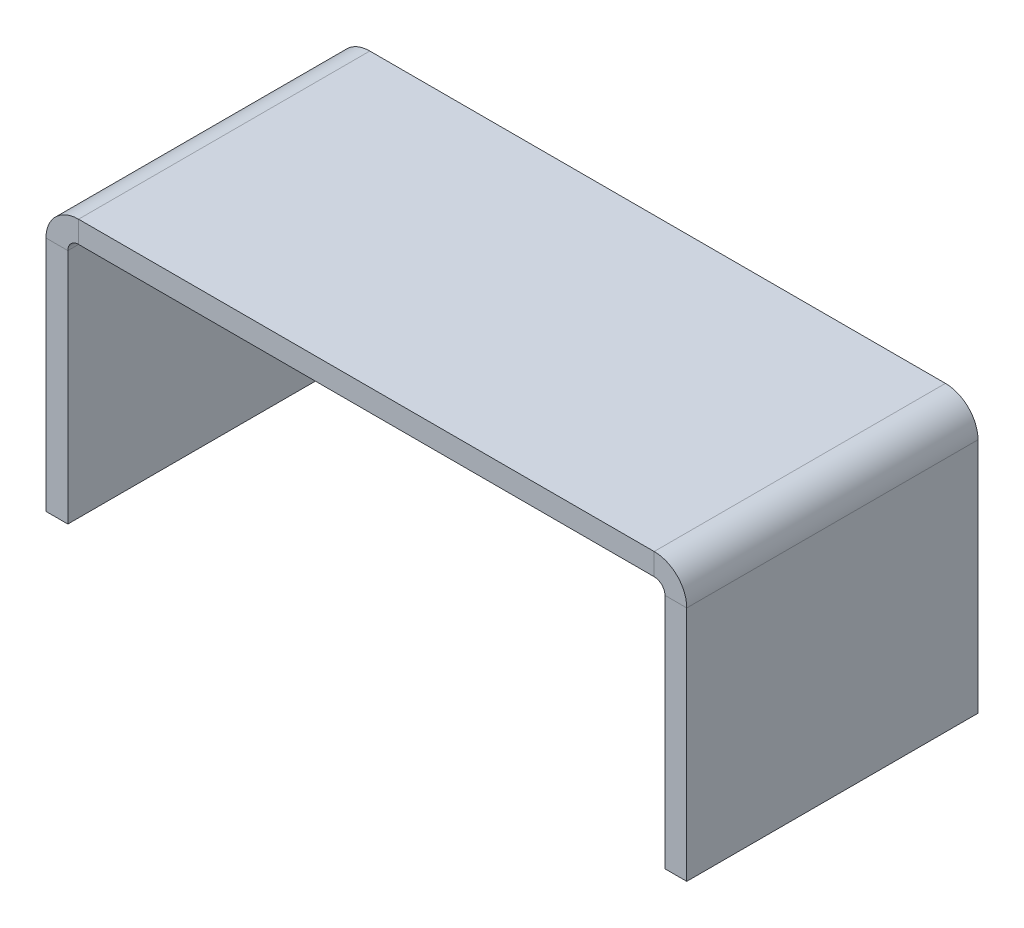
ISO-10303-21;
HEADER;
FILE_DESCRIPTION(('STEP AP214'),'2;1');
FILE_NAME('part.step','',(''),(''),'','','');
FILE_SCHEMA(('AUTOMOTIVE_DESIGN { 1 0 10303 214 1 1 1 1 }'));
ENDSEC;
DATA;
#1=APPLICATION_CONTEXT('core data for automotive mechanical design processes');
#2=APPLICATION_PROTOCOL_DEFINITION('international standard','automotive_design',2000,#1);
#3=PRODUCT_CONTEXT('',#1,'mechanical');
#4=PRODUCT('Part','Part','',(#3));
#5=PRODUCT_RELATED_PRODUCT_CATEGORY('part','',(#4));
#6=PRODUCT_DEFINITION_FORMATION('','',#4);
#7=PRODUCT_DEFINITION_CONTEXT('part definition',#1,'design');
#8=PRODUCT_DEFINITION('design','',#6,#7);
#9=PRODUCT_DEFINITION_SHAPE('','',#8);
#10=(LENGTH_UNIT() NAMED_UNIT(*) SI_UNIT(.MILLI.,.METRE.));
#11=(NAMED_UNIT(*) PLANE_ANGLE_UNIT() SI_UNIT($,.RADIAN.));
#12=(NAMED_UNIT(*) SI_UNIT($,.STERADIAN.) SOLID_ANGLE_UNIT());
#13=UNCERTAINTY_MEASURE_WITH_UNIT(LENGTH_MEASURE(1.E-05),#10,'distance_accuracy_value','');
#14=(GEOMETRIC_REPRESENTATION_CONTEXT(3) GLOBAL_UNCERTAINTY_ASSIGNED_CONTEXT((#13)) GLOBAL_UNIT_ASSIGNED_CONTEXT((#10,
#11,#12)) REPRESENTATION_CONTEXT('',''));
#15=CARTESIAN_POINT('',(0.,0.,0.));
#16=DIRECTION('',(0.,0.,1.));
#17=DIRECTION('',(1.,0.,0.));
#18=AXIS2_PLACEMENT_3D('',#15,#16,#17);
#19=CARTESIAN_POINT('',(0.,-1.5,0.));
#20=DIRECTION('',(0.,-1.,0.));
#21=DIRECTION('',(0.,0.,-1.));
#22=AXIS2_PLACEMENT_3D('',#19,#20,#21);
#23=PLANE('',#22);
#24=DIRECTION('',(-1.,0.,0.));
#25=VECTOR('',#24,1.);
#26=CARTESIAN_POINT('',(-22.,-1.5,-10.));
#27=LINE('',#26,#25);
#28=CARTESIAN_POINT('',(19.7634,-1.5,-10.));
#29=VERTEX_POINT('',#28);
#30=CARTESIAN_POINT('',(-19.7634,-1.5,-10.));
#31=VERTEX_POINT('',#30);
#32=EDGE_CURVE('E90',#29,#31,#27,.T.);
#33=ORIENTED_EDGE('',*,*,#32,.F.);
#34=DIRECTION('',(0.,0.,1.));
#35=VECTOR('',#34,1.);
#36=CARTESIAN_POINT('',(19.7634,-1.5,10.));
#37=LINE('',#36,#35);
#38=CARTESIAN_POINT('',(19.7634,-1.5,10.));
#39=VERTEX_POINT('',#38);
#40=EDGE_CURVE('E226',#39,#29,#37,.F.);
#41=ORIENTED_EDGE('',*,*,#40,.F.);
#42=DIRECTION('',(1.,0.,0.));
#43=VECTOR('',#42,1.);
#44=CARTESIAN_POINT('',(-22.,-1.5,10.));
#45=LINE('',#44,#43);
#46=CARTESIAN_POINT('',(-19.7634,-1.5,10.));
#47=VERTEX_POINT('',#46);
#48=EDGE_CURVE('E13',#47,#39,#45,.T.);
#49=ORIENTED_EDGE('',*,*,#48,.F.);
#50=DIRECTION('',(0.,0.,-1.));
#51=VECTOR('',#50,1.);
#52=CARTESIAN_POINT('',(-19.7634,-1.5,-10.));
#53=LINE('',#52,#51);
#54=EDGE_CURVE('E280',#31,#47,#53,.F.);
#55=ORIENTED_EDGE('',*,*,#54,.F.);
#56=EDGE_LOOP('',(#33,#41,#49,#55));
#57=FACE_BOUND('',#56,.T.);
#58=ADVANCED_FACE('F81',(#57),#23,.T.);
#59=CARTESIAN_POINT('',(0.,0.,0.));
#60=DIRECTION('',(0.,-1.,0.));
#61=DIRECTION('',(0.,0.,-1.));
#62=AXIS2_PLACEMENT_3D('',#59,#60,#61);
#63=PLANE('',#62);
#64=DIRECTION('',(0.,0.,1.));
#65=VECTOR('',#64,1.);
#66=CARTESIAN_POINT('',(19.7634,0.,10.));
#67=LINE('',#66,#65);
#68=CARTESIAN_POINT('',(19.7634,0.,10.));
#69=VERTEX_POINT('',#68);
#70=CARTESIAN_POINT('',(19.7634,0.,-10.));
#71=VERTEX_POINT('',#70);
#72=EDGE_CURVE('E214',#69,#71,#67,.F.);
#73=ORIENTED_EDGE('',*,*,#72,.T.);
#74=DIRECTION('',(-1.,0.,0.));
#75=VECTOR('',#74,1.);
#76=CARTESIAN_POINT('',(-22.,0.,-10.));
#77=LINE('',#76,#75);
#78=CARTESIAN_POINT('',(-19.7634,0.,-10.));
#79=VERTEX_POINT('',#78);
#80=EDGE_CURVE('E286',#71,#79,#77,.T.);
#81=ORIENTED_EDGE('',*,*,#80,.T.);
#82=DIRECTION('',(0.,0.,-1.));
#83=VECTOR('',#82,1.);
#84=CARTESIAN_POINT('',(-19.7634,0.,-10.));
#85=LINE('',#84,#83);
#86=CARTESIAN_POINT('',(-19.7634,0.,10.));
#87=VERTEX_POINT('',#86);
#88=EDGE_CURVE('E268',#79,#87,#85,.F.);
#89=ORIENTED_EDGE('',*,*,#88,.T.);
#90=DIRECTION('',(1.,0.,0.));
#91=VECTOR('',#90,1.);
#92=CARTESIAN_POINT('',(-22.,0.,10.));
#93=LINE('',#92,#91);
#94=EDGE_CURVE('E85',#87,#69,#93,.T.);
#95=ORIENTED_EDGE('',*,*,#94,.T.);
#96=EDGE_LOOP('',(#73,#81,#89,#95));
#97=FACE_BOUND('',#96,.T.);
#98=ADVANCED_FACE('F292',(#97),#63,.F.);
#99=CARTESIAN_POINT('',(-22.,-1.5,10.));
#100=DIRECTION('',(0.,0.,1.));
#101=DIRECTION('',(1.,0.,0.));
#102=AXIS2_PLACEMENT_3D('',#99,#100,#101);
#103=PLANE('',#102);
#104=ORIENTED_EDGE('',*,*,#48,.T.);
#105=DIRECTION('',(0.,1.,0.));
#106=VECTOR('',#105,1.);
#107=CARTESIAN_POINT('',(19.7634,-1.5,10.));
#108=LINE('',#107,#106);
#109=EDGE_CURVE('E220',#39,#69,#108,.T.);
#110=ORIENTED_EDGE('',*,*,#109,.T.);
#111=ORIENTED_EDGE('',*,*,#94,.F.);
#112=DIRECTION('',(0.,1.,0.));
#113=VECTOR('',#112,1.);
#114=CARTESIAN_POINT('',(-19.7634,-1.5,10.));
#115=LINE('',#114,#113);
#116=EDGE_CURVE('E104',#47,#87,#115,.T.);
#117=ORIENTED_EDGE('',*,*,#116,.F.);
#118=EDGE_LOOP('',(#104,#110,#111,#117));
#119=FACE_BOUND('',#118,.T.);
#120=ADVANCED_FACE('F295',(#119),#103,.T.);
#121=CARTESIAN_POINT('',(-22.,-1.5,-10.));
#122=DIRECTION('',(0.,0.,-1.));
#123=DIRECTION('',(-1.,0.,0.));
#124=AXIS2_PLACEMENT_3D('',#121,#122,#123);
#125=PLANE('',#124);
#126=DIRECTION('',(0.,1.,0.));
#127=VECTOR('',#126,1.);
#128=CARTESIAN_POINT('',(19.7634,-1.5,-10.));
#129=LINE('',#128,#127);
#130=EDGE_CURVE('E232',#29,#71,#129,.T.);
#131=ORIENTED_EDGE('',*,*,#130,.F.);
#132=ORIENTED_EDGE('',*,*,#32,.T.);
#133=DIRECTION('',(0.,1.,0.));
#134=VECTOR('',#133,1.);
#135=CARTESIAN_POINT('',(-19.7634,-1.5,-10.));
#136=LINE('',#135,#134);
#137=EDGE_CURVE('E274',#31,#79,#136,.T.);
#138=ORIENTED_EDGE('',*,*,#137,.T.);
#139=ORIENTED_EDGE('',*,*,#80,.F.);
#140=EDGE_LOOP('',(#131,#132,#138,#139));
#141=FACE_BOUND('',#140,.T.);
#142=ADVANCED_FACE('F83',(#141),#125,.T.);
#143=CARTESIAN_POINT('',(-19.7634,-2.2366,10.));
#144=DIRECTION('',(0.,0.,1.));
#145=DIRECTION('',(1.,0.,0.));
#146=AXIS2_PLACEMENT_3D('',#143,#144,#145);
#147=PLANE('',#146);
#148=DIRECTION('',(1.,0.,0.));
#149=VECTOR('',#148,1.);
#150=CARTESIAN_POINT('',(-22.,-2.23659999999999,10.));
#151=LINE('',#150,#149);
#152=CARTESIAN_POINT('',(-20.5,-2.2366,10.));
#153=VERTEX_POINT('',#152);
#154=CARTESIAN_POINT('',(-22.,-2.23659999999999,10.));
#155=VERTEX_POINT('',#154);
#156=EDGE_CURVE('E235',#153,#155,#151,.F.);
#157=ORIENTED_EDGE('',*,*,#156,.F.);
#158=CARTESIAN_POINT('',(-19.7634,-2.2366,10.));
#159=DIRECTION('',(0.,0.,-1.));
#160=DIRECTION('',(-1.,0.,0.));
#161=AXIS2_PLACEMENT_3D('',#158,#159,#160);
#162=CIRCLE('',#161,0.7366);
#163=EDGE_CURVE('E277',#47,#153,#162,.F.);
#164=ORIENTED_EDGE('',*,*,#163,.F.);
#165=ORIENTED_EDGE('',*,*,#116,.T.);
#166=CARTESIAN_POINT('',(-19.7634,-2.2366,10.));
#167=DIRECTION('',(0.,0.,-1.));
#168=DIRECTION('',(-1.,0.,0.));
#169=AXIS2_PLACEMENT_3D('',#166,#167,#168);
#170=CIRCLE('',#169,2.2366);
#171=EDGE_CURVE('E270',#87,#155,#170,.F.);
#172=ORIENTED_EDGE('',*,*,#171,.T.);
#173=EDGE_LOOP('',(#157,#164,#165,#172));
#174=FACE_BOUND('',#173,.T.);
#175=ADVANCED_FACE('F347',(#174),#147,.T.);
#176=CARTESIAN_POINT('',(-19.7634,-2.2366,-10.));
#177=DIRECTION('',(0.,0.,1.));
#178=DIRECTION('',(1.,0.,0.));
#179=AXIS2_PLACEMENT_3D('',#176,#177,#178);
#180=PLANE('',#179);
#181=CARTESIAN_POINT('',(-19.7634,-2.2366,-10.));
#182=DIRECTION('',(0.,0.,-1.));
#183=DIRECTION('',(-1.,0.,0.));
#184=AXIS2_PLACEMENT_3D('',#181,#182,#183);
#185=CIRCLE('',#184,0.7366);
#186=CARTESIAN_POINT('',(-20.5,-2.2366,-10.));
#187=VERTEX_POINT('',#186);
#188=EDGE_CURVE('E241',#187,#31,#185,.T.);
#189=ORIENTED_EDGE('',*,*,#188,.F.);
#190=DIRECTION('',(1.,0.,0.));
#191=VECTOR('',#190,1.);
#192=CARTESIAN_POINT('',(-20.5,-2.2366,-10.));
#193=LINE('',#192,#191);
#194=CARTESIAN_POINT('',(-22.,-2.23659999999999,-10.));
#195=VERTEX_POINT('',#194);
#196=EDGE_CURVE('E261',#187,#195,#193,.F.);
#197=ORIENTED_EDGE('',*,*,#196,.T.);
#198=CARTESIAN_POINT('',(-19.7634,-2.2366,-10.));
#199=DIRECTION('',(0.,0.,-1.));
#200=DIRECTION('',(-1.,0.,0.));
#201=AXIS2_PLACEMENT_3D('',#198,#199,#200);
#202=CIRCLE('',#201,2.2366);
#203=EDGE_CURVE('E271',#195,#79,#202,.T.);
#204=ORIENTED_EDGE('',*,*,#203,.T.);
#205=ORIENTED_EDGE('',*,*,#137,.F.);
#206=EDGE_LOOP('',(#189,#197,#204,#205));
#207=FACE_BOUND('',#206,.T.);
#208=ADVANCED_FACE('F320',(#207),#180,.F.);
#209=CARTESIAN_POINT('',(-19.7634,-2.2366,-10.));
#210=DIRECTION('',(0.,0.,-1.));
#211=DIRECTION('',(-1.,0.,0.));
#212=AXIS2_PLACEMENT_3D('',#209,#210,#211);
#213=CYLINDRICAL_SURFACE('',#212,2.2366);
#214=ORIENTED_EDGE('',*,*,#88,.F.);
#215=ORIENTED_EDGE('',*,*,#203,.F.);
#216=DIRECTION('',(0.,0.,-1.));
#217=VECTOR('',#216,1.);
#218=CARTESIAN_POINT('',(-22.,-2.23659999999999,10.));
#219=LINE('',#218,#217);
#220=EDGE_CURVE('E259',#195,#155,#219,.F.);
#221=ORIENTED_EDGE('',*,*,#220,.T.);
#222=ORIENTED_EDGE('',*,*,#171,.F.);
#223=EDGE_LOOP('',(#214,#215,#221,#222));
#224=FACE_BOUND('',#223,.T.);
#225=ADVANCED_FACE('F345',(#224),#213,.T.);
#226=CARTESIAN_POINT('',(-19.7634,-2.2366,-10.));
#227=DIRECTION('',(0.,0.,-1.));
#228=DIRECTION('',(-1.,0.,0.));
#229=AXIS2_PLACEMENT_3D('',#226,#227,#228);
#230=CYLINDRICAL_SURFACE('',#229,0.7366);
#231=ORIENTED_EDGE('',*,*,#54,.T.);
#232=ORIENTED_EDGE('',*,*,#163,.T.);
#233=DIRECTION('',(0.,0.,-1.));
#234=VECTOR('',#233,1.);
#235=CARTESIAN_POINT('',(-20.5,-2.2366,10.));
#236=LINE('',#235,#234);
#237=EDGE_CURVE('E264',#153,#187,#236,.T.);
#238=ORIENTED_EDGE('',*,*,#237,.T.);
#239=ORIENTED_EDGE('',*,*,#188,.T.);
#240=EDGE_LOOP('',(#231,#232,#238,#239));
#241=FACE_BOUND('',#240,.T.);
#242=ADVANCED_FACE('F322',(#241),#230,.F.);
#243=CARTESIAN_POINT('',(-22.0000000000001,-18.5,-10.));
#244=DIRECTION('',(0.,0.,1.));
#245=DIRECTION('',(1.,0.,0.));
#246=AXIS2_PLACEMENT_3D('',#243,#244,#245);
#247=PLANE('',#246);
#248=ORIENTED_EDGE('',*,*,#196,.F.);
#249=DIRECTION('',(0.,1.,0.));
#250=VECTOR('',#249,1.);
#251=CARTESIAN_POINT('',(-20.5000000000001,-18.5,-10.));
#252=LINE('',#251,#250);
#253=CARTESIAN_POINT('',(-20.5000000000001,-18.5,-10.));
#254=VERTEX_POINT('',#253);
#255=EDGE_CURVE('E257',#187,#254,#252,.F.);
#256=ORIENTED_EDGE('',*,*,#255,.T.);
#257=DIRECTION('',(1.,0.,0.));
#258=VECTOR('',#257,1.);
#259=CARTESIAN_POINT('',(-22.0000000000001,-18.5,-10.));
#260=LINE('',#259,#258);
#261=CARTESIAN_POINT('',(-22.0000000000001,-18.5,-10.));
#262=VERTEX_POINT('',#261);
#263=EDGE_CURVE('E238',#262,#254,#260,.T.);
#264=ORIENTED_EDGE('',*,*,#263,.F.);
#265=DIRECTION('',(0.,-1.,0.));
#266=VECTOR('',#265,1.);
#267=CARTESIAN_POINT('',(-22.,0.,-10.));
#268=LINE('',#267,#266);
#269=EDGE_CURVE('E250',#195,#262,#268,.T.);
#270=ORIENTED_EDGE('',*,*,#269,.F.);
#271=EDGE_LOOP('',(#248,#256,#264,#270));
#272=FACE_BOUND('',#271,.T.);
#273=ADVANCED_FACE('F339',(#272),#247,.F.);
#274=CARTESIAN_POINT('',(-22.,-1.49999999999999,10.));
#275=DIRECTION('',(0.,0.,-1.));
#276=DIRECTION('',(-1.,0.,0.));
#277=AXIS2_PLACEMENT_3D('',#274,#275,#276);
#278=PLANE('',#277);
#279=ORIENTED_EDGE('',*,*,#156,.T.);
#280=DIRECTION('',(0.,1.,0.));
#281=VECTOR('',#280,1.);
#282=CARTESIAN_POINT('',(-22.,0.,10.));
#283=LINE('',#282,#281);
#284=CARTESIAN_POINT('',(-22.0000000000001,-18.5,10.));
#285=VERTEX_POINT('',#284);
#286=EDGE_CURVE('E245',#285,#155,#283,.T.);
#287=ORIENTED_EDGE('',*,*,#286,.F.);
#288=DIRECTION('',(1.,0.,0.));
#289=VECTOR('',#288,1.);
#290=CARTESIAN_POINT('',(-22.0000000000001,-18.5,10.));
#291=LINE('',#290,#289);
#292=CARTESIAN_POINT('',(-20.5000000000001,-18.5,10.));
#293=VERTEX_POINT('',#292);
#294=EDGE_CURVE('E242',#285,#293,#291,.T.);
#295=ORIENTED_EDGE('',*,*,#294,.T.);
#296=DIRECTION('',(0.,-1.,0.));
#297=VECTOR('',#296,1.);
#298=CARTESIAN_POINT('',(-20.5,-1.5,10.));
#299=LINE('',#298,#297);
#300=EDGE_CURVE('E252',#293,#153,#299,.F.);
#301=ORIENTED_EDGE('',*,*,#300,.T.);
#302=EDGE_LOOP('',(#279,#287,#295,#301));
#303=FACE_BOUND('',#302,.T.);
#304=ADVANCED_FACE('F330',(#303),#278,.F.);
#305=CARTESIAN_POINT('',(-22.,0.,0.));
#306=DIRECTION('',(1.,0.,0.));
#307=DIRECTION('',(0.,1.,0.));
#308=AXIS2_PLACEMENT_3D('',#305,#306,#307);
#309=PLANE('',#308);
#310=ORIENTED_EDGE('',*,*,#220,.F.);
#311=ORIENTED_EDGE('',*,*,#269,.T.);
#312=DIRECTION('',(0.,0.,1.));
#313=VECTOR('',#312,1.);
#314=CARTESIAN_POINT('',(-22.0000000000001,-18.5,0.));
#315=LINE('',#314,#313);
#316=EDGE_CURVE('E248',#262,#285,#315,.T.);
#317=ORIENTED_EDGE('',*,*,#316,.T.);
#318=ORIENTED_EDGE('',*,*,#286,.T.);
#319=EDGE_LOOP('',(#310,#311,#317,#318));
#320=FACE_BOUND('',#319,.T.);
#321=ADVANCED_FACE('F342',(#320),#309,.F.);
#322=CARTESIAN_POINT('',(-20.5,0.,0.));
#323=DIRECTION('',(1.,0.,0.));
#324=DIRECTION('',(0.,1.,0.));
#325=AXIS2_PLACEMENT_3D('',#322,#323,#324);
#326=PLANE('',#325);
#327=ORIENTED_EDGE('',*,*,#255,.F.);
#328=ORIENTED_EDGE('',*,*,#237,.F.);
#329=ORIENTED_EDGE('',*,*,#300,.F.);
#330=DIRECTION('',(0.,0.,-1.));
#331=VECTOR('',#330,1.);
#332=CARTESIAN_POINT('',(-20.5000000000001,-18.5,10.));
#333=LINE('',#332,#331);
#334=EDGE_CURVE('E255',#254,#293,#333,.F.);
#335=ORIENTED_EDGE('',*,*,#334,.F.);
#336=EDGE_LOOP('',(#327,#328,#329,#335));
#337=FACE_BOUND('',#336,.T.);
#338=ADVANCED_FACE('F327',(#337),#326,.T.);
#339=CARTESIAN_POINT('',(-22.0000000000001,-18.5,10.));
#340=DIRECTION('',(0.,1.,0.));
#341=DIRECTION('',(-1.,0.,0.));
#342=AXIS2_PLACEMENT_3D('',#339,#340,#341);
#343=PLANE('',#342);
#344=ORIENTED_EDGE('',*,*,#334,.T.);
#345=ORIENTED_EDGE('',*,*,#294,.F.);
#346=ORIENTED_EDGE('',*,*,#316,.F.);
#347=ORIENTED_EDGE('',*,*,#263,.T.);
#348=EDGE_LOOP('',(#344,#345,#346,#347));
#349=FACE_BOUND('',#348,.T.);
#350=ADVANCED_FACE('F335',(#349),#343,.F.);
#351=CARTESIAN_POINT('',(19.7634,-2.2366,-10.));
#352=DIRECTION('',(0.,0.,-1.));
#353=DIRECTION('',(-1.,0.,0.));
#354=AXIS2_PLACEMENT_3D('',#351,#352,#353);
#355=PLANE('',#354);
#356=DIRECTION('',(-1.,0.,0.));
#357=VECTOR('',#356,1.);
#358=CARTESIAN_POINT('',(22.,-2.23659999999999,-10.));
#359=LINE('',#358,#357);
#360=CARTESIAN_POINT('',(20.5,-2.2366,-10.));
#361=VERTEX_POINT('',#360);
#362=CARTESIAN_POINT('',(22.,-2.23659999999999,-10.));
#363=VERTEX_POINT('',#362);
#364=EDGE_CURVE('E196',#361,#363,#359,.F.);
#365=ORIENTED_EDGE('',*,*,#364,.F.);
#366=CARTESIAN_POINT('',(19.7634,-2.2366,-10.));
#367=DIRECTION('',(0.,0.,1.));
#368=DIRECTION('',(1.,0.,0.));
#369=AXIS2_PLACEMENT_3D('',#366,#367,#368);
#370=CIRCLE('',#369,0.7366);
#371=EDGE_CURVE('E223',#29,#361,#370,.F.);
#372=ORIENTED_EDGE('',*,*,#371,.F.);
#373=ORIENTED_EDGE('',*,*,#130,.T.);
#374=CARTESIAN_POINT('',(19.7634,-2.2366,-10.));
#375=DIRECTION('',(0.,0.,1.));
#376=DIRECTION('',(1.,0.,0.));
#377=AXIS2_PLACEMENT_3D('',#374,#375,#376);
#378=CIRCLE('',#377,2.2366);
#379=EDGE_CURVE('E216',#71,#363,#378,.F.);
#380=ORIENTED_EDGE('',*,*,#379,.T.);
#381=EDGE_LOOP('',(#365,#372,#373,#380));
#382=FACE_BOUND('',#381,.T.);
#383=ADVANCED_FACE('F313',(#382),#355,.T.);
#384=CARTESIAN_POINT('',(19.7634,-2.2366,10.));
#385=DIRECTION('',(0.,0.,-1.));
#386=DIRECTION('',(-1.,0.,0.));
#387=AXIS2_PLACEMENT_3D('',#384,#385,#386);
#388=PLANE('',#387);
#389=CARTESIAN_POINT('',(19.7634,-2.2366,10.));
#390=DIRECTION('',(0.,0.,1.));
#391=DIRECTION('',(1.,0.,0.));
#392=AXIS2_PLACEMENT_3D('',#389,#390,#391);
#393=CIRCLE('',#392,0.7366);
#394=CARTESIAN_POINT('',(20.5,-2.2366,10.));
#395=VERTEX_POINT('',#394);
#396=EDGE_CURVE('E229',#395,#39,#393,.T.);
#397=ORIENTED_EDGE('',*,*,#396,.F.);
#398=DIRECTION('',(-1.,0.,0.));
#399=VECTOR('',#398,1.);
#400=CARTESIAN_POINT('',(20.5,-2.2366,10.));
#401=LINE('',#400,#399);
#402=CARTESIAN_POINT('',(22.,-2.23659999999999,10.));
#403=VERTEX_POINT('',#402);
#404=EDGE_CURVE('E208',#395,#403,#401,.F.);
#405=ORIENTED_EDGE('',*,*,#404,.T.);
#406=CARTESIAN_POINT('',(19.7634,-2.2366,10.));
#407=DIRECTION('',(0.,0.,1.));
#408=DIRECTION('',(1.,0.,0.));
#409=AXIS2_PLACEMENT_3D('',#406,#407,#408);
#410=CIRCLE('',#409,2.2366);
#411=EDGE_CURVE('E217',#403,#69,#410,.T.);
#412=ORIENTED_EDGE('',*,*,#411,.T.);
#413=ORIENTED_EDGE('',*,*,#109,.F.);
#414=EDGE_LOOP('',(#397,#405,#412,#413));
#415=FACE_BOUND('',#414,.T.);
#416=ADVANCED_FACE('F301',(#415),#388,.F.);
#417=CARTESIAN_POINT('',(19.7634,-2.2366,10.));
#418=DIRECTION('',(0.,0.,1.));
#419=DIRECTION('',(1.,0.,0.));
#420=AXIS2_PLACEMENT_3D('',#417,#418,#419);
#421=CYLINDRICAL_SURFACE('',#420,2.2366);
#422=ORIENTED_EDGE('',*,*,#72,.F.);
#423=ORIENTED_EDGE('',*,*,#411,.F.);
#424=DIRECTION('',(0.,0.,1.));
#425=VECTOR('',#424,1.);
#426=CARTESIAN_POINT('',(22.,-2.23659999999999,-10.));
#427=LINE('',#426,#425);
#428=EDGE_CURVE('E206',#403,#363,#427,.F.);
#429=ORIENTED_EDGE('',*,*,#428,.T.);
#430=ORIENTED_EDGE('',*,*,#379,.F.);
#431=EDGE_LOOP('',(#422,#423,#429,#430));
#432=FACE_BOUND('',#431,.T.);
#433=ADVANCED_FACE('F300',(#432),#421,.T.);
#434=CARTESIAN_POINT('',(19.7634,-2.2366,10.));
#435=DIRECTION('',(0.,0.,1.));
#436=DIRECTION('',(1.,0.,0.));
#437=AXIS2_PLACEMENT_3D('',#434,#435,#436);
#438=CYLINDRICAL_SURFACE('',#437,0.7366);
#439=ORIENTED_EDGE('',*,*,#40,.T.);
#440=ORIENTED_EDGE('',*,*,#371,.T.);
#441=DIRECTION('',(0.,0.,1.));
#442=VECTOR('',#441,1.);
#443=CARTESIAN_POINT('',(20.5,-2.2366,-10.));
#444=LINE('',#443,#442);
#445=EDGE_CURVE('E211',#361,#395,#444,.T.);
#446=ORIENTED_EDGE('',*,*,#445,.T.);
#447=ORIENTED_EDGE('',*,*,#396,.T.);
#448=EDGE_LOOP('',(#439,#440,#446,#447));
#449=FACE_BOUND('',#448,.T.);
#450=ADVANCED_FACE('F310',(#449),#438,.F.);
#451=CARTESIAN_POINT('',(22.,-18.5,10.));
#452=DIRECTION('',(0.,0.,-1.));
#453=DIRECTION('',(-1.,0.,0.));
#454=AXIS2_PLACEMENT_3D('',#451,#452,#453);
#455=PLANE('',#454);
#456=ORIENTED_EDGE('',*,*,#404,.F.);
#457=DIRECTION('',(0.,1.,0.));
#458=VECTOR('',#457,1.);
#459=CARTESIAN_POINT('',(20.5000000000001,-18.5,10.));
#460=LINE('',#459,#458);
#461=CARTESIAN_POINT('',(20.5000000000001,-18.5,10.));
#462=VERTEX_POINT('',#461);
#463=EDGE_CURVE('E204',#395,#462,#460,.F.);
#464=ORIENTED_EDGE('',*,*,#463,.T.);
#465=DIRECTION('',(-1.,0.,0.));
#466=VECTOR('',#465,1.);
#467=CARTESIAN_POINT('',(22.,-18.5,10.));
#468=LINE('',#467,#466);
#469=CARTESIAN_POINT('',(22.0000000000001,-18.5,10.));
#470=VERTEX_POINT('',#469);
#471=EDGE_CURVE('E192',#470,#462,#468,.T.);
#472=ORIENTED_EDGE('',*,*,#471,.F.);
#473=DIRECTION('',(0.,-1.,0.));
#474=VECTOR('',#473,1.);
#475=CARTESIAN_POINT('',(22.,0.,10.));
#476=LINE('',#475,#474);
#477=EDGE_CURVE('E179',#403,#470,#476,.T.);
#478=ORIENTED_EDGE('',*,*,#477,.F.);
#479=EDGE_LOOP('',(#456,#464,#472,#478));
#480=FACE_BOUND('',#479,.T.);
#481=ADVANCED_FACE('F305',(#480),#455,.F.);
#482=CARTESIAN_POINT('',(22.,-1.49999999999999,-10.));
#483=DIRECTION('',(0.,0.,1.));
#484=DIRECTION('',(1.,0.,0.));
#485=AXIS2_PLACEMENT_3D('',#482,#483,#484);
#486=PLANE('',#485);
#487=ORIENTED_EDGE('',*,*,#364,.T.);
#488=DIRECTION('',(0.,1.,0.));
#489=VECTOR('',#488,1.);
#490=CARTESIAN_POINT('',(22.,0.,-10.));
#491=LINE('',#490,#489);
#492=CARTESIAN_POINT('',(22.0000000000001,-18.5,-10.));
#493=VERTEX_POINT('',#492);
#494=EDGE_CURVE('E177',#493,#363,#491,.T.);
#495=ORIENTED_EDGE('',*,*,#494,.F.);
#496=DIRECTION('',(-1.,0.,0.));
#497=VECTOR('',#496,1.);
#498=CARTESIAN_POINT('',(22.,-18.5,-10.));
#499=LINE('',#498,#497);
#500=CARTESIAN_POINT('',(20.5000000000001,-18.5,-10.));
#501=VERTEX_POINT('',#500);
#502=EDGE_CURVE('E185',#493,#501,#499,.T.);
#503=ORIENTED_EDGE('',*,*,#502,.T.);
#504=DIRECTION('',(0.,-1.,0.));
#505=VECTOR('',#504,1.);
#506=CARTESIAN_POINT('',(20.5,-1.5,-10.));
#507=LINE('',#506,#505);
#508=EDGE_CURVE('E201',#501,#361,#507,.F.);
#509=ORIENTED_EDGE('',*,*,#508,.T.);
#510=EDGE_LOOP('',(#487,#495,#503,#509));
#511=FACE_BOUND('',#510,.T.);
#512=ADVANCED_FACE('F195',(#511),#486,.F.);
#513=CARTESIAN_POINT('',(22.,0.,0.));
#514=DIRECTION('',(-1.,0.,0.));
#515=DIRECTION('',(0.,-1.,0.));
#516=AXIS2_PLACEMENT_3D('',#513,#514,#515);
#517=PLANE('',#516);
#518=ORIENTED_EDGE('',*,*,#428,.F.);
#519=ORIENTED_EDGE('',*,*,#477,.T.);
#520=DIRECTION('',(0.,0.,-1.));
#521=VECTOR('',#520,1.);
#522=CARTESIAN_POINT('',(22.0000000000001,-18.5,0.));
#523=LINE('',#522,#521);
#524=EDGE_CURVE('E172',#470,#493,#523,.T.);
#525=ORIENTED_EDGE('',*,*,#524,.T.);
#526=ORIENTED_EDGE('',*,*,#494,.T.);
#527=EDGE_LOOP('',(#518,#519,#525,#526));
#528=FACE_BOUND('',#527,.T.);
#529=ADVANCED_FACE('F175',(#528),#517,.F.);
#530=CARTESIAN_POINT('',(20.5,0.,0.));
#531=DIRECTION('',(-1.,0.,0.));
#532=DIRECTION('',(0.,-1.,0.));
#533=AXIS2_PLACEMENT_3D('',#530,#531,#532);
#534=PLANE('',#533);
#535=ORIENTED_EDGE('',*,*,#463,.F.);
#536=ORIENTED_EDGE('',*,*,#445,.F.);
#537=ORIENTED_EDGE('',*,*,#508,.F.);
#538=DIRECTION('',(0.,0.,1.));
#539=VECTOR('',#538,1.);
#540=CARTESIAN_POINT('',(20.5000000000001,-18.5,-10.));
#541=LINE('',#540,#539);
#542=EDGE_CURVE('E188',#462,#501,#541,.F.);
#543=ORIENTED_EDGE('',*,*,#542,.F.);
#544=EDGE_LOOP('',(#535,#536,#537,#543));
#545=FACE_BOUND('',#544,.T.);
#546=ADVANCED_FACE('F308',(#545),#534,.T.);
#547=CARTESIAN_POINT('',(22.,-18.5,-10.));
#548=DIRECTION('',(0.,1.,0.));
#549=DIRECTION('',(-1.,0.,0.));
#550=AXIS2_PLACEMENT_3D('',#547,#548,#549);
#551=PLANE('',#550);
#552=ORIENTED_EDGE('',*,*,#542,.T.);
#553=ORIENTED_EDGE('',*,*,#502,.F.);
#554=ORIENTED_EDGE('',*,*,#524,.F.);
#555=ORIENTED_EDGE('',*,*,#471,.T.);
#556=EDGE_LOOP('',(#552,#553,#554,#555));
#557=FACE_BOUND('',#556,.T.);
#558=ADVANCED_FACE('F186',(#557),#551,.F.);
#559=CLOSED_SHELL('',(#58,#98,#120,#142,#175,#208,#225,#242,#273,#304,#321,#338,#350,#383,#416,
#433,#450,#481,#512,#529,#546,#558));
#560=MANIFOLD_SOLID_BREP('B2',#559);
#561=ADVANCED_BREP_SHAPE_REPRESENTATION('',(#18,#560),#14);
#562=SHAPE_DEFINITION_REPRESENTATION(#9,#561);
ENDSEC;
END-ISO-10303-21;
